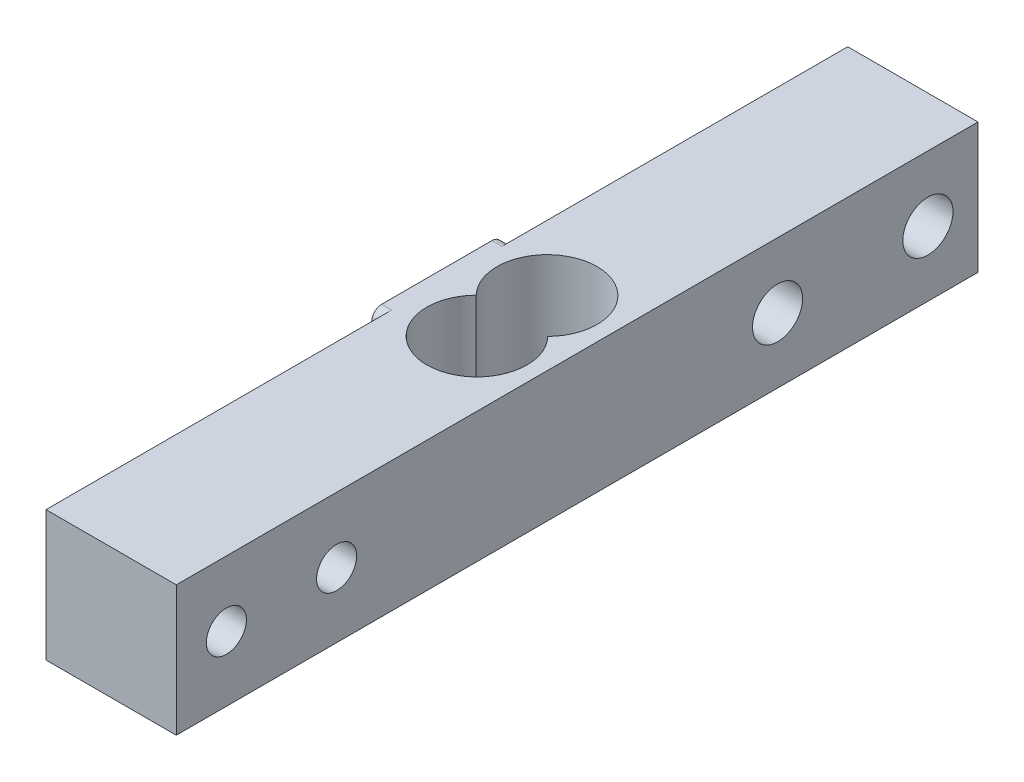
ISO-10303-21;
HEADER;
FILE_DESCRIPTION(('STEP AP214'),'2;1');
FILE_NAME('part.step','',(''),(''),'','','');
FILE_SCHEMA(('AUTOMOTIVE_DESIGN { 1 0 10303 214 1 1 1 1 }'));
ENDSEC;
DATA;
#1=APPLICATION_CONTEXT('core data for automotive mechanical design processes');
#2=APPLICATION_PROTOCOL_DEFINITION('international standard','automotive_design',2000,#1);
#3=PRODUCT_CONTEXT('',#1,'mechanical');
#4=PRODUCT('Part','Part','',(#3));
#5=PRODUCT_RELATED_PRODUCT_CATEGORY('part','',(#4));
#6=PRODUCT_DEFINITION_FORMATION('','',#4);
#7=PRODUCT_DEFINITION_CONTEXT('part definition',#1,'design');
#8=PRODUCT_DEFINITION('design','',#6,#7);
#9=PRODUCT_DEFINITION_SHAPE('','',#8);
#10=(LENGTH_UNIT() NAMED_UNIT(*) SI_UNIT(.MILLI.,.METRE.));
#11=(NAMED_UNIT(*) PLANE_ANGLE_UNIT() SI_UNIT($,.RADIAN.));
#12=(NAMED_UNIT(*) SI_UNIT($,.STERADIAN.) SOLID_ANGLE_UNIT());
#13=UNCERTAINTY_MEASURE_WITH_UNIT(LENGTH_MEASURE(1.E-05),#10,'distance_accuracy_value','');
#14=(GEOMETRIC_REPRESENTATION_CONTEXT(3) GLOBAL_UNCERTAINTY_ASSIGNED_CONTEXT((#13)) GLOBAL_UNIT_ASSIGNED_CONTEXT((#10,
#11,#12)) REPRESENTATION_CONTEXT('',''));
#15=CARTESIAN_POINT('',(0.,0.,0.));
#16=DIRECTION('',(0.,0.,1.));
#17=DIRECTION('',(1.,0.,0.));
#18=AXIS2_PLACEMENT_3D('',#15,#16,#17);
#19=CARTESIAN_POINT('',(-6.5,6.5,40.));
#20=DIRECTION('',(1.,0.,0.));
#21=DIRECTION('',(0.,1.,0.));
#22=AXIS2_PLACEMENT_3D('',#19,#20,#21);
#23=PLANE('',#22);
#24=CARTESIAN_POINT('',(-6.5,0.,24.));
#25=DIRECTION('',(1.,0.,0.));
#26=DIRECTION('',(0.,0.,-1.));
#27=AXIS2_PLACEMENT_3D('',#24,#25,#26);
#28=CIRCLE('',#27,2.);
#29=CARTESIAN_POINT('',(-6.5,0.,22.));
#30=VERTEX_POINT('',#29);
#31=EDGE_CURVE('E309',#30,#30,#28,.T.);
#32=ORIENTED_EDGE('',*,*,#31,.T.);
#33=EDGE_LOOP('',(#32));
#34=FACE_BOUND('',#33,.T.);
#35=CARTESIAN_POINT('',(-6.5,0.,35.));
#36=DIRECTION('',(1.,0.,0.));
#37=DIRECTION('',(0.,0.,-1.));
#38=AXIS2_PLACEMENT_3D('',#35,#36,#37);
#39=CIRCLE('',#38,2.);
#40=CARTESIAN_POINT('',(-6.5,0.,33.));
#41=VERTEX_POINT('',#40);
#42=EDGE_CURVE('E173',#41,#41,#39,.T.);
#43=ORIENTED_EDGE('',*,*,#42,.T.);
#44=EDGE_LOOP('',(#43));
#45=FACE_BOUND('',#44,.T.);
#46=DIRECTION('',(0.,1.,0.));
#47=VECTOR('',#46,1.);
#48=CARTESIAN_POINT('',(-6.5,6.5,6.5));
#49=LINE('',#48,#47);
#50=CARTESIAN_POINT('',(-6.5,-5.5,6.5));
#51=VERTEX_POINT('',#50);
#52=CARTESIAN_POINT('',(-6.5,5.5,6.5));
#53=VERTEX_POINT('',#52);
#54=EDGE_CURVE('E296',#51,#53,#49,.T.);
#55=ORIENTED_EDGE('',*,*,#54,.F.);
#56=CARTESIAN_POINT('',(-6.5,-5.5,5.5));
#57=DIRECTION('',(1.,0.,0.));
#58=DIRECTION('',(0.,1.,0.));
#59=AXIS2_PLACEMENT_3D('',#56,#57,#58);
#60=CIRCLE('',#59,1.);
#61=CARTESIAN_POINT('',(-6.5,-6.5,5.5));
#62=VERTEX_POINT('',#61);
#63=EDGE_CURVE('E260',#51,#62,#60,.T.);
#64=ORIENTED_EDGE('',*,*,#63,.T.);
#65=DIRECTION('',(0.,0.,-1.));
#66=VECTOR('',#65,1.);
#67=CARTESIAN_POINT('',(-6.5,-6.5,40.));
#68=LINE('',#67,#66);
#69=CARTESIAN_POINT('',(-6.5,-6.5,40.));
#70=VERTEX_POINT('',#69);
#71=EDGE_CURVE('E210',#70,#62,#68,.T.);
#72=ORIENTED_EDGE('',*,*,#71,.F.);
#73=DIRECTION('',(0.,-1.,0.));
#74=VECTOR('',#73,1.);
#75=CARTESIAN_POINT('',(-6.5,6.5,40.));
#76=LINE('',#75,#74);
#77=CARTESIAN_POINT('',(-6.5,6.5,40.));
#78=VERTEX_POINT('',#77);
#79=EDGE_CURVE('E186',#78,#70,#76,.T.);
#80=ORIENTED_EDGE('',*,*,#79,.F.);
#81=DIRECTION('',(0.,0.,-1.));
#82=VECTOR('',#81,1.);
#83=CARTESIAN_POINT('',(-6.5,6.5,40.));
#84=LINE('',#83,#82);
#85=CARTESIAN_POINT('',(-6.5,6.5,5.5));
#86=VERTEX_POINT('',#85);
#87=EDGE_CURVE('E214',#78,#86,#84,.T.);
#88=ORIENTED_EDGE('',*,*,#87,.T.);
#89=CARTESIAN_POINT('',(-6.5,5.5,5.5));
#90=DIRECTION('',(1.,0.,0.));
#91=DIRECTION('',(0.,1.,0.));
#92=AXIS2_PLACEMENT_3D('',#89,#90,#91);
#93=CIRCLE('',#92,1.);
#94=EDGE_CURVE('E264',#86,#53,#93,.T.);
#95=ORIENTED_EDGE('',*,*,#94,.T.);
#96=EDGE_LOOP('',(#55,#64,#72,#80,#88,#95));
#97=FACE_BOUND('',#96,.T.);
#98=ADVANCED_FACE('F40',(#34,#45,#97),#23,.F.);
#99=CARTESIAN_POINT('',(-6.5,0.,-35.));
#100=DIRECTION('',(1.,0.,0.));
#101=DIRECTION('',(0.,0.,-1.));
#102=AXIS2_PLACEMENT_3D('',#99,#100,#101);
#103=CIRCLE('',#102,2.5);
#104=CARTESIAN_POINT('',(-6.5,0.,-37.5));
#105=VERTEX_POINT('',#104);
#106=EDGE_CURVE('E324',#105,#105,#103,.T.);
#107=ORIENTED_EDGE('',*,*,#106,.T.);
#108=EDGE_LOOP('',(#107));
#109=FACE_BOUND('',#108,.T.);
#110=CARTESIAN_POINT('',(-6.5,0.,-20.));
#111=DIRECTION('',(1.,0.,0.));
#112=DIRECTION('',(0.,0.,-1.));
#113=AXIS2_PLACEMENT_3D('',#110,#111,#112);
#114=CIRCLE('',#113,2.5);
#115=CARTESIAN_POINT('',(-6.5,0.,-22.5));
#116=VERTEX_POINT('',#115);
#117=EDGE_CURVE('E317',#116,#116,#114,.T.);
#118=ORIENTED_EDGE('',*,*,#117,.T.);
#119=EDGE_LOOP('',(#118));
#120=FACE_BOUND('',#119,.T.);
#121=DIRECTION('',(0.,-1.,0.));
#122=VECTOR('',#121,1.);
#123=CARTESIAN_POINT('',(-6.5,6.5,-6.5));
#124=LINE('',#123,#122);
#125=CARTESIAN_POINT('',(-6.5,5.5,-6.5));
#126=VERTEX_POINT('',#125);
#127=CARTESIAN_POINT('',(-6.5,-5.5,-6.5));
#128=VERTEX_POINT('',#127);
#129=EDGE_CURVE('E268',#126,#128,#124,.T.);
#130=ORIENTED_EDGE('',*,*,#129,.F.);
#131=CARTESIAN_POINT('',(-6.5,5.5,-5.5));
#132=DIRECTION('',(1.,0.,0.));
#133=DIRECTION('',(0.,1.,0.));
#134=AXIS2_PLACEMENT_3D('',#131,#132,#133);
#135=CIRCLE('',#134,1.);
#136=CARTESIAN_POINT('',(-6.5,6.5,-5.5));
#137=VERTEX_POINT('',#136);
#138=EDGE_CURVE('E49',#126,#137,#135,.T.);
#139=ORIENTED_EDGE('',*,*,#138,.T.);
#140=CARTESIAN_POINT('',(-6.5,6.5,-40.));
#141=VERTEX_POINT('',#140);
#142=EDGE_CURVE('E213',#137,#141,#84,.T.);
#143=ORIENTED_EDGE('',*,*,#142,.T.);
#144=DIRECTION('',(0.,-1.,0.));
#145=VECTOR('',#144,1.);
#146=CARTESIAN_POINT('',(-6.5,6.5,-40.));
#147=LINE('',#146,#145);
#148=CARTESIAN_POINT('',(-6.5,-6.5,-40.));
#149=VERTEX_POINT('',#148);
#150=EDGE_CURVE('E200',#141,#149,#147,.T.);
#151=ORIENTED_EDGE('',*,*,#150,.T.);
#152=CARTESIAN_POINT('',(-6.5,-6.5,-5.5));
#153=VERTEX_POINT('',#152);
#154=EDGE_CURVE('E209',#153,#149,#68,.T.);
#155=ORIENTED_EDGE('',*,*,#154,.F.);
#156=CARTESIAN_POINT('',(-6.5,-5.5,-5.5));
#157=DIRECTION('',(1.,0.,0.));
#158=DIRECTION('',(0.,1.,0.));
#159=AXIS2_PLACEMENT_3D('',#156,#157,#158);
#160=CIRCLE('',#159,1.);
#161=EDGE_CURVE('E11',#153,#128,#160,.T.);
#162=ORIENTED_EDGE('',*,*,#161,.T.);
#163=EDGE_LOOP('',(#130,#139,#143,#151,#155,#162));
#164=FACE_BOUND('',#163,.T.);
#165=ADVANCED_FACE('F267',(#109,#120,#164),#23,.F.);
#166=CARTESIAN_POINT('',(6.5,6.5,40.));
#167=DIRECTION('',(-1.,0.,0.));
#168=DIRECTION('',(0.,0.,1.));
#169=AXIS2_PLACEMENT_3D('',#166,#167,#168);
#170=PLANE('',#169);
#171=CARTESIAN_POINT('',(6.5,0.,35.));
#172=DIRECTION('',(1.,0.,0.));
#173=DIRECTION('',(0.,0.,-1.));
#174=AXIS2_PLACEMENT_3D('',#171,#172,#173);
#175=CIRCLE('',#174,2.);
#176=CARTESIAN_POINT('',(6.5,0.,33.));
#177=VERTEX_POINT('',#176);
#178=EDGE_CURVE('E305',#177,#177,#175,.T.);
#179=ORIENTED_EDGE('',*,*,#178,.F.);
#180=EDGE_LOOP('',(#179));
#181=FACE_BOUND('',#180,.T.);
#182=CARTESIAN_POINT('',(6.5,0.,24.));
#183=DIRECTION('',(1.,0.,0.));
#184=DIRECTION('',(0.,0.,-1.));
#185=AXIS2_PLACEMENT_3D('',#182,#183,#184);
#186=CIRCLE('',#185,2.);
#187=CARTESIAN_POINT('',(6.5,0.,22.));
#188=VERTEX_POINT('',#187);
#189=EDGE_CURVE('E313',#188,#188,#186,.T.);
#190=ORIENTED_EDGE('',*,*,#189,.F.);
#191=EDGE_LOOP('',(#190));
#192=FACE_BOUND('',#191,.T.);
#193=CARTESIAN_POINT('',(6.5,0.,-20.));
#194=DIRECTION('',(1.,0.,0.));
#195=DIRECTION('',(0.,0.,-1.));
#196=AXIS2_PLACEMENT_3D('',#193,#194,#195);
#197=CIRCLE('',#196,2.5);
#198=CARTESIAN_POINT('',(6.5,0.,-22.5));
#199=VERTEX_POINT('',#198);
#200=EDGE_CURVE('E321',#199,#199,#197,.T.);
#201=ORIENTED_EDGE('',*,*,#200,.F.);
#202=EDGE_LOOP('',(#201));
#203=FACE_BOUND('',#202,.T.);
#204=CARTESIAN_POINT('',(6.5,0.,-35.));
#205=DIRECTION('',(1.,0.,0.));
#206=DIRECTION('',(0.,0.,-1.));
#207=AXIS2_PLACEMENT_3D('',#204,#205,#206);
#208=CIRCLE('',#207,2.5);
#209=CARTESIAN_POINT('',(6.5,0.,-37.5));
#210=VERTEX_POINT('',#209);
#211=EDGE_CURVE('E169',#210,#210,#208,.T.);
#212=ORIENTED_EDGE('',*,*,#211,.F.);
#213=EDGE_LOOP('',(#212));
#214=FACE_BOUND('',#213,.T.);
#215=DIRECTION('',(0.,1.,0.));
#216=VECTOR('',#215,1.);
#217=CARTESIAN_POINT('',(6.5,6.5,-40.));
#218=LINE('',#217,#216);
#219=CARTESIAN_POINT('',(6.5,-6.5,-40.));
#220=VERTEX_POINT('',#219);
#221=CARTESIAN_POINT('',(6.5,6.5,-40.));
#222=VERTEX_POINT('',#221);
#223=EDGE_CURVE('E176',#220,#222,#218,.T.);
#224=ORIENTED_EDGE('',*,*,#223,.T.);
#225=DIRECTION('',(0.,0.,-1.));
#226=VECTOR('',#225,1.);
#227=CARTESIAN_POINT('',(6.5,6.5,40.));
#228=LINE('',#227,#226);
#229=CARTESIAN_POINT('',(6.5,6.5,40.));
#230=VERTEX_POINT('',#229);
#231=EDGE_CURVE('E217',#230,#222,#228,.T.);
#232=ORIENTED_EDGE('',*,*,#231,.F.);
#233=DIRECTION('',(0.,1.,0.));
#234=VECTOR('',#233,1.);
#235=CARTESIAN_POINT('',(6.5,6.5,40.));
#236=LINE('',#235,#234);
#237=CARTESIAN_POINT('',(6.5,-6.5,40.));
#238=VERTEX_POINT('',#237);
#239=EDGE_CURVE('E178',#238,#230,#236,.T.);
#240=ORIENTED_EDGE('',*,*,#239,.F.);
#241=DIRECTION('',(0.,0.,-1.));
#242=VECTOR('',#241,1.);
#243=CARTESIAN_POINT('',(6.5,-6.5,40.));
#244=LINE('',#243,#242);
#245=EDGE_CURVE('E192',#238,#220,#244,.T.);
#246=ORIENTED_EDGE('',*,*,#245,.T.);
#247=EDGE_LOOP('',(#224,#232,#240,#246));
#248=FACE_BOUND('',#247,.T.);
#249=ADVANCED_FACE('F335',(#181,#192,#203,#214,#248),#170,.F.);
#250=CARTESIAN_POINT('',(-6.5,6.5,40.));
#251=DIRECTION('',(0.,-1.,0.));
#252=DIRECTION('',(1.,0.,0.));
#253=AXIS2_PLACEMENT_3D('',#250,#251,#252);
#254=PLANE('',#253);
#255=CARTESIAN_POINT('',(0.,6.5,-3.5));
#256=DIRECTION('',(0.,1.,0.));
#257=DIRECTION('',(-1.,0.,0.));
#258=AXIS2_PLACEMENT_3D('',#255,#256,#257);
#259=CIRCLE('',#258,5.);
#260=CARTESIAN_POINT('',(3.57071421427142,6.5,0.));
#261=VERTEX_POINT('',#260);
#262=CARTESIAN_POINT('',(-3.57071421427143,6.5,0.));
#263=VERTEX_POINT('',#262);
#264=EDGE_CURVE('E164',#261,#263,#259,.T.);
#265=ORIENTED_EDGE('',*,*,#264,.F.);
#266=CARTESIAN_POINT('',(0.,6.5,3.5));
#267=DIRECTION('',(0.,1.,0.));
#268=DIRECTION('',(-1.,0.,0.));
#269=AXIS2_PLACEMENT_3D('',#266,#267,#268);
#270=CIRCLE('',#269,5.);
#271=EDGE_CURVE('E148',#263,#261,#270,.T.);
#272=ORIENTED_EDGE('',*,*,#271,.F.);
#273=EDGE_LOOP('',(#265,#272));
#274=FACE_BOUND('',#273,.T.);
#275=DIRECTION('',(0.,0.,-1.));
#276=VECTOR('',#275,1.);
#277=CARTESIAN_POINT('',(-7.5,6.5,-6.5));
#278=LINE('',#277,#276);
#279=CARTESIAN_POINT('',(-7.5,6.5,5.49999999999999));
#280=VERTEX_POINT('',#279);
#281=CARTESIAN_POINT('',(-7.5,6.5,-5.5));
#282=VERTEX_POINT('',#281);
#283=EDGE_CURVE('E275',#280,#282,#278,.T.);
#284=ORIENTED_EDGE('',*,*,#283,.F.);
#285=DIRECTION('',(1.,0.,0.));
#286=VECTOR('',#285,1.);
#287=CARTESIAN_POINT('',(-6.5,6.5,5.5));
#288=LINE('',#287,#286);
#289=EDGE_CURVE('E250',#280,#86,#288,.T.);
#290=ORIENTED_EDGE('',*,*,#289,.T.);
#291=ORIENTED_EDGE('',*,*,#87,.F.);
#292=DIRECTION('',(-1.,0.,0.));
#293=VECTOR('',#292,1.);
#294=CARTESIAN_POINT('',(-6.5,6.5,40.));
#295=LINE('',#294,#293);
#296=EDGE_CURVE('E182',#230,#78,#295,.T.);
#297=ORIENTED_EDGE('',*,*,#296,.F.);
#298=ORIENTED_EDGE('',*,*,#231,.T.);
#299=DIRECTION('',(-1.,0.,0.));
#300=VECTOR('',#299,1.);
#301=CARTESIAN_POINT('',(-6.5,6.5,-40.));
#302=LINE('',#301,#300);
#303=EDGE_CURVE('E196',#222,#141,#302,.T.);
#304=ORIENTED_EDGE('',*,*,#303,.T.);
#305=ORIENTED_EDGE('',*,*,#142,.F.);
#306=DIRECTION('',(1.,0.,0.));
#307=VECTOR('',#306,1.);
#308=CARTESIAN_POINT('',(-6.5,6.5,-5.5));
#309=LINE('',#308,#307);
#310=EDGE_CURVE('E247',#137,#282,#309,.F.);
#311=ORIENTED_EDGE('',*,*,#310,.T.);
#312=EDGE_LOOP('',(#284,#290,#291,#297,#298,#304,#305,#311));
#313=FACE_BOUND('',#312,.T.);
#314=ADVANCED_FACE('F274',(#274,#313),#254,.F.);
#315=CARTESIAN_POINT('',(-6.5,-6.5,40.));
#316=DIRECTION('',(0.,1.,0.));
#317=DIRECTION('',(-1.,0.,0.));
#318=AXIS2_PLACEMENT_3D('',#315,#316,#317);
#319=PLANE('',#318);
#320=CARTESIAN_POINT('',(0.,-6.5,-3.5));
#321=DIRECTION('',(0.,1.,0.));
#322=DIRECTION('',(-1.,0.,0.));
#323=AXIS2_PLACEMENT_3D('',#320,#321,#322);
#324=CIRCLE('',#323,5.);
#325=CARTESIAN_POINT('',(3.57071421427143,-6.5,0.));
#326=VERTEX_POINT('',#325);
#327=CARTESIAN_POINT('',(-3.57071421427142,-6.5,0.));
#328=VERTEX_POINT('',#327);
#329=EDGE_CURVE('E154',#326,#328,#324,.T.);
#330=ORIENTED_EDGE('',*,*,#329,.T.);
#331=CARTESIAN_POINT('',(0.,-6.5,3.5));
#332=DIRECTION('',(0.,1.,0.));
#333=DIRECTION('',(-1.,0.,0.));
#334=AXIS2_PLACEMENT_3D('',#331,#332,#333);
#335=CIRCLE('',#334,5.);
#336=EDGE_CURVE('E145',#328,#326,#335,.T.);
#337=ORIENTED_EDGE('',*,*,#336,.T.);
#338=EDGE_LOOP('',(#330,#337));
#339=FACE_BOUND('',#338,.T.);
#340=ORIENTED_EDGE('',*,*,#71,.T.);
#341=DIRECTION('',(1.,0.,0.));
#342=VECTOR('',#341,1.);
#343=CARTESIAN_POINT('',(-6.5,-6.5,5.5));
#344=LINE('',#343,#342);
#345=CARTESIAN_POINT('',(-7.5,-6.5,5.5));
#346=VERTEX_POINT('',#345);
#347=EDGE_CURVE('E232',#62,#346,#344,.F.);
#348=ORIENTED_EDGE('',*,*,#347,.T.);
#349=DIRECTION('',(0.,0.,1.));
#350=VECTOR('',#349,1.);
#351=CARTESIAN_POINT('',(-7.5,-6.5,-6.5));
#352=LINE('',#351,#350);
#353=CARTESIAN_POINT('',(-7.5,-6.5,-5.5));
#354=VERTEX_POINT('',#353);
#355=EDGE_CURVE('E290',#354,#346,#352,.T.);
#356=ORIENTED_EDGE('',*,*,#355,.F.);
#357=DIRECTION('',(1.,0.,0.));
#358=VECTOR('',#357,1.);
#359=CARTESIAN_POINT('',(-6.5,-6.5,-5.5));
#360=LINE('',#359,#358);
#361=EDGE_CURVE('E228',#354,#153,#360,.T.);
#362=ORIENTED_EDGE('',*,*,#361,.T.);
#363=ORIENTED_EDGE('',*,*,#154,.T.);
#364=DIRECTION('',(1.,0.,0.));
#365=VECTOR('',#364,1.);
#366=CARTESIAN_POINT('',(-6.5,-6.5,-40.));
#367=LINE('',#366,#365);
#368=EDGE_CURVE('E183',#149,#220,#367,.T.);
#369=ORIENTED_EDGE('',*,*,#368,.T.);
#370=ORIENTED_EDGE('',*,*,#245,.F.);
#371=DIRECTION('',(1.,0.,0.));
#372=VECTOR('',#371,1.);
#373=CARTESIAN_POINT('',(-6.5,-6.5,40.));
#374=LINE('',#373,#372);
#375=EDGE_CURVE('E189',#70,#238,#374,.T.);
#376=ORIENTED_EDGE('',*,*,#375,.F.);
#377=EDGE_LOOP('',(#340,#348,#356,#362,#363,#369,#370,#376));
#378=FACE_BOUND('',#377,.T.);
#379=ADVANCED_FACE('F161',(#339,#378),#319,.F.);
#380=CARTESIAN_POINT('',(0.,0.,40.));
#381=DIRECTION('',(0.,0.,1.));
#382=DIRECTION('',(1.,0.,0.));
#383=AXIS2_PLACEMENT_3D('',#380,#381,#382);
#384=PLANE('',#383);
#385=ORIENTED_EDGE('',*,*,#239,.T.);
#386=ORIENTED_EDGE('',*,*,#296,.T.);
#387=ORIENTED_EDGE('',*,*,#79,.T.);
#388=ORIENTED_EDGE('',*,*,#375,.T.);
#389=EDGE_LOOP('',(#385,#386,#387,#388));
#390=FACE_BOUND('',#389,.T.);
#391=ADVANCED_FACE('F351',(#390),#384,.T.);
#392=CARTESIAN_POINT('',(0.,0.,-40.));
#393=DIRECTION('',(0.,0.,1.));
#394=DIRECTION('',(1.,0.,0.));
#395=AXIS2_PLACEMENT_3D('',#392,#393,#394);
#396=PLANE('',#395);
#397=ORIENTED_EDGE('',*,*,#223,.F.);
#398=ORIENTED_EDGE('',*,*,#368,.F.);
#399=ORIENTED_EDGE('',*,*,#150,.F.);
#400=ORIENTED_EDGE('',*,*,#303,.F.);
#401=EDGE_LOOP('',(#397,#398,#399,#400));
#402=FACE_BOUND('',#401,.T.);
#403=ADVANCED_FACE('F346',(#402),#396,.F.);
#404=CARTESIAN_POINT('',(0.,-6.5,3.5));
#405=DIRECTION('',(0.,1.,0.));
#406=DIRECTION('',(-1.,0.,0.));
#407=AXIS2_PLACEMENT_3D('',#404,#405,#406);
#408=CYLINDRICAL_SURFACE('',#407,5.);
#409=ORIENTED_EDGE('',*,*,#271,.T.);
#410=DIRECTION('',(0.,1.,0.));
#411=VECTOR('',#410,1.);
#412=CARTESIAN_POINT('',(3.57071421427143,-6.5,0.));
#413=LINE('',#412,#411);
#414=EDGE_CURVE('E141',#326,#261,#413,.T.);
#415=ORIENTED_EDGE('',*,*,#414,.F.);
#416=ORIENTED_EDGE('',*,*,#336,.F.);
#417=DIRECTION('',(0.,1.,0.));
#418=VECTOR('',#417,1.);
#419=CARTESIAN_POINT('',(-3.57071421427142,-6.5,0.));
#420=LINE('',#419,#418);
#421=EDGE_CURVE('E153',#328,#263,#420,.T.);
#422=ORIENTED_EDGE('',*,*,#421,.T.);
#423=EDGE_LOOP('',(#409,#415,#416,#422));
#424=FACE_BOUND('',#423,.T.);
#425=ADVANCED_FACE('F143',(#424),#408,.F.);
#426=CARTESIAN_POINT('',(0.,-6.5,-3.5));
#427=DIRECTION('',(0.,1.,0.));
#428=DIRECTION('',(-1.,0.,0.));
#429=AXIS2_PLACEMENT_3D('',#426,#427,#428);
#430=CYLINDRICAL_SURFACE('',#429,5.);
#431=ORIENTED_EDGE('',*,*,#264,.T.);
#432=ORIENTED_EDGE('',*,*,#421,.F.);
#433=ORIENTED_EDGE('',*,*,#329,.F.);
#434=ORIENTED_EDGE('',*,*,#414,.T.);
#435=EDGE_LOOP('',(#431,#432,#433,#434));
#436=FACE_BOUND('',#435,.T.);
#437=ADVANCED_FACE('F157',(#436),#430,.F.);
#438=CARTESIAN_POINT('',(-6.5,0.,-35.));
#439=DIRECTION('',(1.,0.,0.));
#440=DIRECTION('',(0.,0.,-1.));
#441=AXIS2_PLACEMENT_3D('',#438,#439,#440);
#442=CYLINDRICAL_SURFACE('',#441,2.5);
#443=CARTESIAN_POINT('',(-6.5,0.,-37.5));
#444=CARTESIAN_POINT('',(-6.36458333333333,0.,-37.5));
#445=CARTESIAN_POINT('',(-6.22916666666667,0.,-37.5));
#446=CARTESIAN_POINT('',(-5.95833333333333,0.,-37.5));
#447=CARTESIAN_POINT('',(-5.82291666666667,0.,-37.5));
#448=CARTESIAN_POINT('',(-5.55208333333333,0.,-37.5));
#449=CARTESIAN_POINT('',(-5.41666666666667,0.,-37.5));
#450=CARTESIAN_POINT('',(-5.14583333333333,0.,-37.5));
#451=CARTESIAN_POINT('',(-5.01041666666667,0.,-37.5));
#452=CARTESIAN_POINT('',(-4.73958333333333,0.,-37.5));
#453=CARTESIAN_POINT('',(-4.60416666666667,0.,-37.5));
#454=CARTESIAN_POINT('',(-4.33333333333333,0.,-37.5));
#455=CARTESIAN_POINT('',(-4.19791666666667,0.,-37.5));
#456=CARTESIAN_POINT('',(-3.92708333333333,0.,-37.5));
#457=CARTESIAN_POINT('',(-3.79166666666667,0.,-37.5));
#458=CARTESIAN_POINT('',(-3.52083333333333,0.,-37.5));
#459=CARTESIAN_POINT('',(-3.38541666666667,0.,-37.5));
#460=CARTESIAN_POINT('',(-3.11458333333333,0.,-37.5));
#461=CARTESIAN_POINT('',(-2.97916666666667,0.,-37.5));
#462=CARTESIAN_POINT('',(-2.70833333333333,0.,-37.5));
#463=CARTESIAN_POINT('',(-2.57291666666667,0.,-37.5));
#464=CARTESIAN_POINT('',(-2.30208333333333,0.,-37.5));
#465=CARTESIAN_POINT('',(-2.16666666666667,0.,-37.5));
#466=CARTESIAN_POINT('',(-1.89583333333333,0.,-37.5));
#467=CARTESIAN_POINT('',(-1.76041666666667,0.,-37.5));
#468=CARTESIAN_POINT('',(-1.48958333333333,0.,-37.5));
#469=CARTESIAN_POINT('',(-1.35416666666667,0.,-37.5));
#470=CARTESIAN_POINT('',(-1.08333333333333,0.,-37.5));
#471=CARTESIAN_POINT('',(-0.947916666666668,0.,-37.5));
#472=CARTESIAN_POINT('',(-0.677083333333334,0.,-37.5));
#473=CARTESIAN_POINT('',(-0.541666666666668,0.,-37.5));
#474=CARTESIAN_POINT('',(-0.270833333333334,0.,-37.5));
#475=CARTESIAN_POINT('',(-0.135416666666668,0.,-37.5));
#476=CARTESIAN_POINT('',(0.135416666666666,0.,-37.5));
#477=CARTESIAN_POINT('',(0.270833333333333,0.,-37.5));
#478=CARTESIAN_POINT('',(0.541666666666666,0.,-37.5));
#479=CARTESIAN_POINT('',(0.677083333333332,0.,-37.5));
#480=CARTESIAN_POINT('',(0.947916666666666,0.,-37.5));
#481=CARTESIAN_POINT('',(1.08333333333333,0.,-37.5));
#482=CARTESIAN_POINT('',(1.35416666666667,0.,-37.5));
#483=CARTESIAN_POINT('',(1.48958333333333,0.,-37.5));
#484=CARTESIAN_POINT('',(1.76041666666667,0.,-37.5));
#485=CARTESIAN_POINT('',(1.89583333333333,0.,-37.5));
#486=CARTESIAN_POINT('',(2.16666666666667,0.,-37.5));
#487=CARTESIAN_POINT('',(2.30208333333333,0.,-37.5));
#488=CARTESIAN_POINT('',(2.57291666666667,0.,-37.5));
#489=CARTESIAN_POINT('',(2.70833333333333,0.,-37.5));
#490=CARTESIAN_POINT('',(2.97916666666667,0.,-37.5));
#491=CARTESIAN_POINT('',(3.11458333333333,0.,-37.5));
#492=CARTESIAN_POINT('',(3.38541666666667,0.,-37.5));
#493=CARTESIAN_POINT('',(3.52083333333333,0.,-37.5));
#494=CARTESIAN_POINT('',(3.79166666666667,0.,-37.5));
#495=CARTESIAN_POINT('',(3.92708333333333,0.,-37.5));
#496=CARTESIAN_POINT('',(4.19791666666667,0.,-37.5));
#497=CARTESIAN_POINT('',(4.33333333333333,0.,-37.5));
#498=CARTESIAN_POINT('',(4.60416666666667,0.,-37.5));
#499=CARTESIAN_POINT('',(4.73958333333333,0.,-37.5));
#500=CARTESIAN_POINT('',(5.01041666666667,0.,-37.5));
#501=CARTESIAN_POINT('',(5.14583333333333,0.,-37.5));
#502=CARTESIAN_POINT('',(5.41666666666667,0.,-37.5));
#503=CARTESIAN_POINT('',(5.55208333333333,0.,-37.5));
#504=CARTESIAN_POINT('',(5.82291666666667,0.,-37.5));
#505=CARTESIAN_POINT('',(5.95833333333333,0.,-37.5));
#506=CARTESIAN_POINT('',(6.22916666666667,0.,-37.5));
#507=CARTESIAN_POINT('',(6.36458333333333,0.,-37.5));
#508=CARTESIAN_POINT('',(6.5,0.,-37.5));
#509=B_SPLINE_CURVE_WITH_KNOTS('',3,(#443,#444,#445,#446,#447,#448,#449,#450,#451,#452,#453,
#454,#455,#456,#457,#458,#459,#460,#461,#462,#463,#464,#465,#466,#467,#468,#469,#470,#471,#472,
#473,#474,#475,#476,#477,#478,#479,#480,#481,#482,#483,#484,#485,#486,#487,#488,#489,#490,#491,
#492,#493,#494,#495,#496,#497,#498,#499,#500,#501,#502,#503,#504,#505,#506,#507,#508),
.UNSPECIFIED.,.F.,.F.,(4,2,2,2,2,2,2,2,2,2,2,2,2,2,2,2,2,2,2,2,2,2,2,2,2,2,2,2,2,2,2,2,4),(0.,
0.40625,0.812500000000001,1.21875,1.625,2.03125,2.4375,2.84375,3.25,3.65625,4.0625,4.46875,
4.875,5.28125,5.6875,6.09375,6.5,6.90625,7.3125,7.71875,8.125,8.53125,8.9375,9.34375,9.75,
10.15625,10.5625,10.96875,11.375,11.78125,12.1875,12.59375,13.),.UNSPECIFIED.);
#510=EDGE_CURVE('BSEAM333',#105,#210,#509,.T.);
#511=ORIENTED_EDGE('',*,*,#106,.F.);
#512=ORIENTED_EDGE('',*,*,#211,.T.);
#513=ORIENTED_EDGE('',*,*,#510,.T.);
#514=ORIENTED_EDGE('',*,*,#510,.F.);
#515=EDGE_LOOP('',(#511,#513,#512,#514));
#516=FACE_BOUND('',#515,.T.);
#517=ADVANCED_FACE('F333',(#516),#442,.F.);
#518=CARTESIAN_POINT('',(-6.5,0.,-20.));
#519=DIRECTION('',(1.,0.,0.));
#520=DIRECTION('',(0.,0.,-1.));
#521=AXIS2_PLACEMENT_3D('',#518,#519,#520);
#522=CYLINDRICAL_SURFACE('',#521,2.5);
#523=CARTESIAN_POINT('',(-6.5,0.,-22.5));
#524=CARTESIAN_POINT('',(-6.36458333333333,0.,-22.5));
#525=CARTESIAN_POINT('',(-6.22916666666667,0.,-22.5));
#526=CARTESIAN_POINT('',(-5.95833333333333,0.,-22.5));
#527=CARTESIAN_POINT('',(-5.82291666666667,0.,-22.5));
#528=CARTESIAN_POINT('',(-5.55208333333333,0.,-22.5));
#529=CARTESIAN_POINT('',(-5.41666666666667,0.,-22.5));
#530=CARTESIAN_POINT('',(-5.14583333333333,0.,-22.5));
#531=CARTESIAN_POINT('',(-5.01041666666667,0.,-22.5));
#532=CARTESIAN_POINT('',(-4.73958333333333,0.,-22.5));
#533=CARTESIAN_POINT('',(-4.60416666666667,0.,-22.5));
#534=CARTESIAN_POINT('',(-4.33333333333333,0.,-22.5));
#535=CARTESIAN_POINT('',(-4.19791666666667,0.,-22.5));
#536=CARTESIAN_POINT('',(-3.92708333333333,0.,-22.5));
#537=CARTESIAN_POINT('',(-3.79166666666667,0.,-22.5));
#538=CARTESIAN_POINT('',(-3.52083333333333,0.,-22.5));
#539=CARTESIAN_POINT('',(-3.38541666666667,0.,-22.5));
#540=CARTESIAN_POINT('',(-3.11458333333333,0.,-22.5));
#541=CARTESIAN_POINT('',(-2.97916666666667,0.,-22.5));
#542=CARTESIAN_POINT('',(-2.70833333333333,0.,-22.5));
#543=CARTESIAN_POINT('',(-2.57291666666667,0.,-22.5));
#544=CARTESIAN_POINT('',(-2.30208333333333,0.,-22.5));
#545=CARTESIAN_POINT('',(-2.16666666666667,0.,-22.5));
#546=CARTESIAN_POINT('',(-1.89583333333333,0.,-22.5));
#547=CARTESIAN_POINT('',(-1.76041666666667,0.,-22.5));
#548=CARTESIAN_POINT('',(-1.48958333333333,0.,-22.5));
#549=CARTESIAN_POINT('',(-1.35416666666667,0.,-22.5));
#550=CARTESIAN_POINT('',(-1.08333333333333,0.,-22.5));
#551=CARTESIAN_POINT('',(-0.947916666666668,0.,-22.5));
#552=CARTESIAN_POINT('',(-0.677083333333334,0.,-22.5));
#553=CARTESIAN_POINT('',(-0.541666666666668,0.,-22.5));
#554=CARTESIAN_POINT('',(-0.270833333333334,0.,-22.5));
#555=CARTESIAN_POINT('',(-0.135416666666668,0.,-22.5));
#556=CARTESIAN_POINT('',(0.135416666666666,0.,-22.5));
#557=CARTESIAN_POINT('',(0.270833333333333,0.,-22.5));
#558=CARTESIAN_POINT('',(0.541666666666666,0.,-22.5));
#559=CARTESIAN_POINT('',(0.677083333333332,0.,-22.5));
#560=CARTESIAN_POINT('',(0.947916666666666,0.,-22.5));
#561=CARTESIAN_POINT('',(1.08333333333333,0.,-22.5));
#562=CARTESIAN_POINT('',(1.35416666666667,0.,-22.5));
#563=CARTESIAN_POINT('',(1.48958333333333,0.,-22.5));
#564=CARTESIAN_POINT('',(1.76041666666667,0.,-22.5));
#565=CARTESIAN_POINT('',(1.89583333333333,0.,-22.5));
#566=CARTESIAN_POINT('',(2.16666666666667,0.,-22.5));
#567=CARTESIAN_POINT('',(2.30208333333333,0.,-22.5));
#568=CARTESIAN_POINT('',(2.57291666666667,0.,-22.5));
#569=CARTESIAN_POINT('',(2.70833333333333,0.,-22.5));
#570=CARTESIAN_POINT('',(2.97916666666667,0.,-22.5));
#571=CARTESIAN_POINT('',(3.11458333333333,0.,-22.5));
#572=CARTESIAN_POINT('',(3.38541666666667,0.,-22.5));
#573=CARTESIAN_POINT('',(3.52083333333333,0.,-22.5));
#574=CARTESIAN_POINT('',(3.79166666666667,0.,-22.5));
#575=CARTESIAN_POINT('',(3.92708333333333,0.,-22.5));
#576=CARTESIAN_POINT('',(4.19791666666667,0.,-22.5));
#577=CARTESIAN_POINT('',(4.33333333333333,0.,-22.5));
#578=CARTESIAN_POINT('',(4.60416666666667,0.,-22.5));
#579=CARTESIAN_POINT('',(4.73958333333333,0.,-22.5));
#580=CARTESIAN_POINT('',(5.01041666666667,0.,-22.5));
#581=CARTESIAN_POINT('',(5.14583333333333,0.,-22.5));
#582=CARTESIAN_POINT('',(5.41666666666667,0.,-22.5));
#583=CARTESIAN_POINT('',(5.55208333333333,0.,-22.5));
#584=CARTESIAN_POINT('',(5.82291666666667,0.,-22.5));
#585=CARTESIAN_POINT('',(5.95833333333333,0.,-22.5));
#586=CARTESIAN_POINT('',(6.22916666666667,0.,-22.5));
#587=CARTESIAN_POINT('',(6.36458333333333,0.,-22.5));
#588=CARTESIAN_POINT('',(6.5,0.,-22.5));
#589=B_SPLINE_CURVE_WITH_KNOTS('',3,(#523,#524,#525,#526,#527,#528,#529,#530,#531,#532,#533,
#534,#535,#536,#537,#538,#539,#540,#541,#542,#543,#544,#545,#546,#547,#548,#549,#550,#551,#552,
#553,#554,#555,#556,#557,#558,#559,#560,#561,#562,#563,#564,#565,#566,#567,#568,#569,#570,#571,
#572,#573,#574,#575,#576,#577,#578,#579,#580,#581,#582,#583,#584,#585,#586,#587,#588),
.UNSPECIFIED.,.F.,.F.,(4,2,2,2,2,2,2,2,2,2,2,2,2,2,2,2,2,2,2,2,2,2,2,2,2,2,2,2,2,2,2,2,4),(0.,
0.40625,0.812500000000001,1.21875,1.625,2.03125,2.4375,2.84375,3.25,3.65625,4.0625,4.46875,
4.875,5.28125,5.6875,6.09375,6.5,6.90625,7.3125,7.71875,8.125,8.53125,8.9375,9.34375,9.75,
10.15625,10.5625,10.96875,11.375,11.78125,12.1875,12.59375,13.),.UNSPECIFIED.);
#590=EDGE_CURVE('BSEAM492',#116,#199,#589,.T.);
#591=ORIENTED_EDGE('',*,*,#117,.F.);
#592=ORIENTED_EDGE('',*,*,#200,.T.);
#593=ORIENTED_EDGE('',*,*,#590,.T.);
#594=ORIENTED_EDGE('',*,*,#590,.F.);
#595=EDGE_LOOP('',(#591,#593,#592,#594));
#596=FACE_BOUND('',#595,.T.);
#597=ADVANCED_FACE('F492',(#596),#522,.F.);
#598=CARTESIAN_POINT('',(-6.5,0.,24.));
#599=DIRECTION('',(1.,0.,0.));
#600=DIRECTION('',(0.,0.,-1.));
#601=AXIS2_PLACEMENT_3D('',#598,#599,#600);
#602=CYLINDRICAL_SURFACE('',#601,2.);
#603=CARTESIAN_POINT('',(-6.5,0.,22.));
#604=CARTESIAN_POINT('',(-6.36458333333333,0.,22.));
#605=CARTESIAN_POINT('',(-6.22916666666667,0.,22.));
#606=CARTESIAN_POINT('',(-5.95833333333333,0.,22.));
#607=CARTESIAN_POINT('',(-5.82291666666667,0.,22.));
#608=CARTESIAN_POINT('',(-5.55208333333333,0.,22.));
#609=CARTESIAN_POINT('',(-5.41666666666667,0.,22.));
#610=CARTESIAN_POINT('',(-5.14583333333333,0.,22.));
#611=CARTESIAN_POINT('',(-5.01041666666667,0.,22.));
#612=CARTESIAN_POINT('',(-4.73958333333333,0.,22.));
#613=CARTESIAN_POINT('',(-4.60416666666667,0.,22.));
#614=CARTESIAN_POINT('',(-4.33333333333333,0.,22.));
#615=CARTESIAN_POINT('',(-4.19791666666667,0.,22.));
#616=CARTESIAN_POINT('',(-3.92708333333333,0.,22.));
#617=CARTESIAN_POINT('',(-3.79166666666667,0.,22.));
#618=CARTESIAN_POINT('',(-3.52083333333333,0.,22.));
#619=CARTESIAN_POINT('',(-3.38541666666667,0.,22.));
#620=CARTESIAN_POINT('',(-3.11458333333333,0.,22.));
#621=CARTESIAN_POINT('',(-2.97916666666667,0.,22.));
#622=CARTESIAN_POINT('',(-2.70833333333333,0.,22.));
#623=CARTESIAN_POINT('',(-2.57291666666667,0.,22.));
#624=CARTESIAN_POINT('',(-2.30208333333333,0.,22.));
#625=CARTESIAN_POINT('',(-2.16666666666667,0.,22.));
#626=CARTESIAN_POINT('',(-1.89583333333333,0.,22.));
#627=CARTESIAN_POINT('',(-1.76041666666667,0.,22.));
#628=CARTESIAN_POINT('',(-1.48958333333333,0.,22.));
#629=CARTESIAN_POINT('',(-1.35416666666667,0.,22.));
#630=CARTESIAN_POINT('',(-1.08333333333333,0.,22.));
#631=CARTESIAN_POINT('',(-0.947916666666668,0.,22.));
#632=CARTESIAN_POINT('',(-0.677083333333334,0.,22.));
#633=CARTESIAN_POINT('',(-0.541666666666668,0.,22.));
#634=CARTESIAN_POINT('',(-0.270833333333334,0.,22.));
#635=CARTESIAN_POINT('',(-0.135416666666668,0.,22.));
#636=CARTESIAN_POINT('',(0.135416666666666,0.,22.));
#637=CARTESIAN_POINT('',(0.270833333333333,0.,22.));
#638=CARTESIAN_POINT('',(0.541666666666666,0.,22.));
#639=CARTESIAN_POINT('',(0.677083333333332,0.,22.));
#640=CARTESIAN_POINT('',(0.947916666666666,0.,22.));
#641=CARTESIAN_POINT('',(1.08333333333333,0.,22.));
#642=CARTESIAN_POINT('',(1.35416666666667,0.,22.));
#643=CARTESIAN_POINT('',(1.48958333333333,0.,22.));
#644=CARTESIAN_POINT('',(1.76041666666667,0.,22.));
#645=CARTESIAN_POINT('',(1.89583333333333,0.,22.));
#646=CARTESIAN_POINT('',(2.16666666666667,0.,22.));
#647=CARTESIAN_POINT('',(2.30208333333333,0.,22.));
#648=CARTESIAN_POINT('',(2.57291666666667,0.,22.));
#649=CARTESIAN_POINT('',(2.70833333333333,0.,22.));
#650=CARTESIAN_POINT('',(2.97916666666667,0.,22.));
#651=CARTESIAN_POINT('',(3.11458333333333,0.,22.));
#652=CARTESIAN_POINT('',(3.38541666666667,0.,22.));
#653=CARTESIAN_POINT('',(3.52083333333333,0.,22.));
#654=CARTESIAN_POINT('',(3.79166666666667,0.,22.));
#655=CARTESIAN_POINT('',(3.92708333333333,0.,22.));
#656=CARTESIAN_POINT('',(4.19791666666667,0.,22.));
#657=CARTESIAN_POINT('',(4.33333333333333,0.,22.));
#658=CARTESIAN_POINT('',(4.60416666666667,0.,22.));
#659=CARTESIAN_POINT('',(4.73958333333333,0.,22.));
#660=CARTESIAN_POINT('',(5.01041666666667,0.,22.));
#661=CARTESIAN_POINT('',(5.14583333333333,0.,22.));
#662=CARTESIAN_POINT('',(5.41666666666667,0.,22.));
#663=CARTESIAN_POINT('',(5.55208333333333,0.,22.));
#664=CARTESIAN_POINT('',(5.82291666666667,0.,22.));
#665=CARTESIAN_POINT('',(5.95833333333333,0.,22.));
#666=CARTESIAN_POINT('',(6.22916666666667,0.,22.));
#667=CARTESIAN_POINT('',(6.36458333333333,0.,22.));
#668=CARTESIAN_POINT('',(6.5,0.,22.));
#669=B_SPLINE_CURVE_WITH_KNOTS('',3,(#603,#604,#605,#606,#607,#608,#609,#610,#611,#612,#613,
#614,#615,#616,#617,#618,#619,#620,#621,#622,#623,#624,#625,#626,#627,#628,#629,#630,#631,#632,
#633,#634,#635,#636,#637,#638,#639,#640,#641,#642,#643,#644,#645,#646,#647,#648,#649,#650,#651,
#652,#653,#654,#655,#656,#657,#658,#659,#660,#661,#662,#663,#664,#665,#666,#667,#668),
.UNSPECIFIED.,.F.,.F.,(4,2,2,2,2,2,2,2,2,2,2,2,2,2,2,2,2,2,2,2,2,2,2,2,2,2,2,2,2,2,2,2,4),(0.,
0.40625,0.812500000000001,1.21875,1.625,2.03125,2.4375,2.84375,3.25,3.65625,4.0625,4.46875,
4.875,5.28125,5.6875,6.09375,6.5,6.90625,7.3125,7.71875,8.125,8.53125,8.9375,9.34375,9.75,
10.15625,10.5625,10.96875,11.375,11.78125,12.1875,12.59375,13.),.UNSPECIFIED.);
#670=EDGE_CURVE('BSEAM483',#30,#188,#669,.T.);
#671=ORIENTED_EDGE('',*,*,#31,.F.);
#672=ORIENTED_EDGE('',*,*,#189,.T.);
#673=ORIENTED_EDGE('',*,*,#670,.T.);
#674=ORIENTED_EDGE('',*,*,#670,.F.);
#675=EDGE_LOOP('',(#671,#673,#672,#674));
#676=FACE_BOUND('',#675,.T.);
#677=ADVANCED_FACE('F483',(#676),#602,.F.);
#678=CARTESIAN_POINT('',(-6.5,0.,35.));
#679=DIRECTION('',(1.,0.,0.));
#680=DIRECTION('',(0.,0.,-1.));
#681=AXIS2_PLACEMENT_3D('',#678,#679,#680);
#682=CYLINDRICAL_SURFACE('',#681,2.);
#683=CARTESIAN_POINT('',(-6.5,0.,33.));
#684=CARTESIAN_POINT('',(-6.36458333333333,0.,33.));
#685=CARTESIAN_POINT('',(-6.22916666666667,0.,33.));
#686=CARTESIAN_POINT('',(-5.95833333333333,0.,33.));
#687=CARTESIAN_POINT('',(-5.82291666666667,0.,33.));
#688=CARTESIAN_POINT('',(-5.55208333333333,0.,33.));
#689=CARTESIAN_POINT('',(-5.41666666666667,0.,33.));
#690=CARTESIAN_POINT('',(-5.14583333333333,0.,33.));
#691=CARTESIAN_POINT('',(-5.01041666666667,0.,33.));
#692=CARTESIAN_POINT('',(-4.73958333333333,0.,33.));
#693=CARTESIAN_POINT('',(-4.60416666666667,0.,33.));
#694=CARTESIAN_POINT('',(-4.33333333333333,0.,33.));
#695=CARTESIAN_POINT('',(-4.19791666666667,0.,33.));
#696=CARTESIAN_POINT('',(-3.92708333333333,0.,33.));
#697=CARTESIAN_POINT('',(-3.79166666666667,0.,33.));
#698=CARTESIAN_POINT('',(-3.52083333333333,0.,33.));
#699=CARTESIAN_POINT('',(-3.38541666666667,0.,33.));
#700=CARTESIAN_POINT('',(-3.11458333333333,0.,33.));
#701=CARTESIAN_POINT('',(-2.97916666666667,0.,33.));
#702=CARTESIAN_POINT('',(-2.70833333333333,0.,33.));
#703=CARTESIAN_POINT('',(-2.57291666666667,0.,33.));
#704=CARTESIAN_POINT('',(-2.30208333333333,0.,33.));
#705=CARTESIAN_POINT('',(-2.16666666666667,0.,33.));
#706=CARTESIAN_POINT('',(-1.89583333333333,0.,33.));
#707=CARTESIAN_POINT('',(-1.76041666666667,0.,33.));
#708=CARTESIAN_POINT('',(-1.48958333333333,0.,33.));
#709=CARTESIAN_POINT('',(-1.35416666666667,0.,33.));
#710=CARTESIAN_POINT('',(-1.08333333333333,0.,33.));
#711=CARTESIAN_POINT('',(-0.947916666666668,0.,33.));
#712=CARTESIAN_POINT('',(-0.677083333333334,0.,33.));
#713=CARTESIAN_POINT('',(-0.541666666666668,0.,33.));
#714=CARTESIAN_POINT('',(-0.270833333333334,0.,33.));
#715=CARTESIAN_POINT('',(-0.135416666666668,0.,33.));
#716=CARTESIAN_POINT('',(0.135416666666666,0.,33.));
#717=CARTESIAN_POINT('',(0.270833333333333,0.,33.));
#718=CARTESIAN_POINT('',(0.541666666666666,0.,33.));
#719=CARTESIAN_POINT('',(0.677083333333332,0.,33.));
#720=CARTESIAN_POINT('',(0.947916666666666,0.,33.));
#721=CARTESIAN_POINT('',(1.08333333333333,0.,33.));
#722=CARTESIAN_POINT('',(1.35416666666667,0.,33.));
#723=CARTESIAN_POINT('',(1.48958333333333,0.,33.));
#724=CARTESIAN_POINT('',(1.76041666666667,0.,33.));
#725=CARTESIAN_POINT('',(1.89583333333333,0.,33.));
#726=CARTESIAN_POINT('',(2.16666666666667,0.,33.));
#727=CARTESIAN_POINT('',(2.30208333333333,0.,33.));
#728=CARTESIAN_POINT('',(2.57291666666667,0.,33.));
#729=CARTESIAN_POINT('',(2.70833333333333,0.,33.));
#730=CARTESIAN_POINT('',(2.97916666666667,0.,33.));
#731=CARTESIAN_POINT('',(3.11458333333333,0.,33.));
#732=CARTESIAN_POINT('',(3.38541666666667,0.,33.));
#733=CARTESIAN_POINT('',(3.52083333333333,0.,33.));
#734=CARTESIAN_POINT('',(3.79166666666667,0.,33.));
#735=CARTESIAN_POINT('',(3.92708333333333,0.,33.));
#736=CARTESIAN_POINT('',(4.19791666666667,0.,33.));
#737=CARTESIAN_POINT('',(4.33333333333333,0.,33.));
#738=CARTESIAN_POINT('',(4.60416666666667,0.,33.));
#739=CARTESIAN_POINT('',(4.73958333333333,0.,33.));
#740=CARTESIAN_POINT('',(5.01041666666667,0.,33.));
#741=CARTESIAN_POINT('',(5.14583333333333,0.,33.));
#742=CARTESIAN_POINT('',(5.41666666666667,0.,33.));
#743=CARTESIAN_POINT('',(5.55208333333333,0.,33.));
#744=CARTESIAN_POINT('',(5.82291666666667,0.,33.));
#745=CARTESIAN_POINT('',(5.95833333333333,0.,33.));
#746=CARTESIAN_POINT('',(6.22916666666667,0.,33.));
#747=CARTESIAN_POINT('',(6.36458333333333,0.,33.));
#748=CARTESIAN_POINT('',(6.5,0.,33.));
#749=B_SPLINE_CURVE_WITH_KNOTS('',3,(#683,#684,#685,#686,#687,#688,#689,#690,#691,#692,#693,
#694,#695,#696,#697,#698,#699,#700,#701,#702,#703,#704,#705,#706,#707,#708,#709,#710,#711,#712,
#713,#714,#715,#716,#717,#718,#719,#720,#721,#722,#723,#724,#725,#726,#727,#728,#729,#730,#731,
#732,#733,#734,#735,#736,#737,#738,#739,#740,#741,#742,#743,#744,#745,#746,#747,#748),
.UNSPECIFIED.,.F.,.F.,(4,2,2,2,2,2,2,2,2,2,2,2,2,2,2,2,2,2,2,2,2,2,2,2,2,2,2,2,2,2,2,2,4),(0.,
0.40625,0.812500000000001,1.21875,1.625,2.03125,2.4375,2.84375,3.25,3.65625,4.0625,4.46875,
4.875,5.28125,5.6875,6.09375,6.5,6.90625,7.3125,7.71875,8.125,8.53125,8.9375,9.34375,9.75,
10.15625,10.5625,10.96875,11.375,11.78125,12.1875,12.59375,13.),.UNSPECIFIED.);
#750=EDGE_CURVE('BSEAM447',#41,#177,#749,.T.);
#751=ORIENTED_EDGE('',*,*,#42,.F.);
#752=ORIENTED_EDGE('',*,*,#178,.T.);
#753=ORIENTED_EDGE('',*,*,#750,.T.);
#754=ORIENTED_EDGE('',*,*,#750,.F.);
#755=EDGE_LOOP('',(#751,#753,#752,#754));
#756=FACE_BOUND('',#755,.T.);
#757=ADVANCED_FACE('F447',(#756),#682,.F.);
#758=CARTESIAN_POINT('',(-7.5,6.5,6.5));
#759=DIRECTION('',(0.,0.,-1.));
#760=DIRECTION('',(-1.,0.,0.));
#761=AXIS2_PLACEMENT_3D('',#758,#759,#760);
#762=PLANE('',#761);
#763=DIRECTION('',(0.,1.,0.));
#764=VECTOR('',#763,1.);
#765=CARTESIAN_POINT('',(-7.5,6.5,6.5));
#766=LINE('',#765,#764);
#767=CARTESIAN_POINT('',(-7.5,-5.5,6.5));
#768=VERTEX_POINT('',#767);
#769=CARTESIAN_POINT('',(-7.5,5.5,6.5));
#770=VERTEX_POINT('',#769);
#771=EDGE_CURVE('E286',#768,#770,#766,.T.);
#772=ORIENTED_EDGE('',*,*,#771,.F.);
#773=DIRECTION('',(1.,0.,0.));
#774=VECTOR('',#773,1.);
#775=CARTESIAN_POINT('',(-7.5,-5.5,6.5));
#776=LINE('',#775,#774);
#777=EDGE_CURVE('E224',#768,#51,#776,.T.);
#778=ORIENTED_EDGE('',*,*,#777,.T.);
#779=ORIENTED_EDGE('',*,*,#54,.T.);
#780=DIRECTION('',(1.,0.,0.));
#781=VECTOR('',#780,1.);
#782=CARTESIAN_POINT('',(-7.5,5.5,6.5));
#783=LINE('',#782,#781);
#784=EDGE_CURVE('E221',#53,#770,#783,.F.);
#785=ORIENTED_EDGE('',*,*,#784,.T.);
#786=EDGE_LOOP('',(#772,#778,#779,#785));
#787=FACE_BOUND('',#786,.T.);
#788=ADVANCED_FACE('F370',(#787),#762,.F.);
#789=CARTESIAN_POINT('',(-7.5,6.5,-6.5));
#790=DIRECTION('',(0.,0.,1.));
#791=DIRECTION('',(1.,0.,0.));
#792=AXIS2_PLACEMENT_3D('',#789,#790,#791);
#793=PLANE('',#792);
#794=DIRECTION('',(0.,-1.,0.));
#795=VECTOR('',#794,1.);
#796=CARTESIAN_POINT('',(-7.5,6.5,-6.5));
#797=LINE('',#796,#795);
#798=CARTESIAN_POINT('',(-7.5,5.5,-6.5));
#799=VERTEX_POINT('',#798);
#800=CARTESIAN_POINT('',(-7.5,-5.5,-6.5));
#801=VERTEX_POINT('',#800);
#802=EDGE_CURVE('E285',#799,#801,#797,.T.);
#803=ORIENTED_EDGE('',*,*,#802,.F.);
#804=DIRECTION('',(1.,0.,0.));
#805=VECTOR('',#804,1.);
#806=CARTESIAN_POINT('',(-7.5,5.5,-6.5));
#807=LINE('',#806,#805);
#808=EDGE_CURVE('E257',#799,#126,#807,.T.);
#809=ORIENTED_EDGE('',*,*,#808,.T.);
#810=ORIENTED_EDGE('',*,*,#129,.T.);
#811=DIRECTION('',(1.,0.,0.));
#812=VECTOR('',#811,1.);
#813=CARTESIAN_POINT('',(-7.5,-5.5,-6.5));
#814=LINE('',#813,#812);
#815=EDGE_CURVE('E254',#128,#801,#814,.F.);
#816=ORIENTED_EDGE('',*,*,#815,.T.);
#817=EDGE_LOOP('',(#803,#809,#810,#816));
#818=FACE_BOUND('',#817,.T.);
#819=ADVANCED_FACE('F362',(#818),#793,.F.);
#820=CARTESIAN_POINT('',(-7.5,0.,0.));
#821=DIRECTION('',(-1.,0.,0.));
#822=DIRECTION('',(0.,-1.,0.));
#823=AXIS2_PLACEMENT_3D('',#820,#821,#822);
#824=PLANE('',#823);
#825=ORIENTED_EDGE('',*,*,#355,.T.);
#826=CARTESIAN_POINT('',(-7.5,-5.5,5.5));
#827=DIRECTION('',(-1.,0.,0.));
#828=DIRECTION('',(0.,-1.,0.));
#829=AXIS2_PLACEMENT_3D('',#826,#827,#828);
#830=CIRCLE('',#829,1.);
#831=EDGE_CURVE('E244',#346,#768,#830,.T.);
#832=ORIENTED_EDGE('',*,*,#831,.T.);
#833=ORIENTED_EDGE('',*,*,#771,.T.);
#834=CARTESIAN_POINT('',(-7.5,5.5,5.5));
#835=DIRECTION('',(-1.,0.,0.));
#836=DIRECTION('',(0.,-1.,0.));
#837=AXIS2_PLACEMENT_3D('',#834,#835,#836);
#838=CIRCLE('',#837,1.);
#839=EDGE_CURVE('E241',#770,#280,#838,.T.);
#840=ORIENTED_EDGE('',*,*,#839,.T.);
#841=ORIENTED_EDGE('',*,*,#283,.T.);
#842=CARTESIAN_POINT('',(-7.5,5.5,-5.5));
#843=DIRECTION('',(-1.,0.,0.));
#844=DIRECTION('',(0.,-1.,0.));
#845=AXIS2_PLACEMENT_3D('',#842,#843,#844);
#846=CIRCLE('',#845,1.);
#847=EDGE_CURVE('E238',#282,#799,#846,.T.);
#848=ORIENTED_EDGE('',*,*,#847,.T.);
#849=ORIENTED_EDGE('',*,*,#802,.T.);
#850=CARTESIAN_POINT('',(-7.5,-5.5,-5.5));
#851=DIRECTION('',(-1.,0.,0.));
#852=DIRECTION('',(0.,-1.,0.));
#853=AXIS2_PLACEMENT_3D('',#850,#851,#852);
#854=CIRCLE('',#853,1.);
#855=EDGE_CURVE('E235',#801,#354,#854,.T.);
#856=ORIENTED_EDGE('',*,*,#855,.T.);
#857=EDGE_LOOP('',(#825,#832,#833,#840,#841,#848,#849,#856));
#858=FACE_BOUND('',#857,.T.);
#859=ADVANCED_FACE('F279',(#858),#824,.T.);
#860=CARTESIAN_POINT('',(-7.5,-5.5,5.5));
#861=DIRECTION('',(1.,0.,0.));
#862=DIRECTION('',(0.,1.,0.));
#863=AXIS2_PLACEMENT_3D('',#860,#861,#862);
#864=CYLINDRICAL_SURFACE('',#863,1.);
#865=ORIENTED_EDGE('',*,*,#831,.F.);
#866=ORIENTED_EDGE('',*,*,#347,.F.);
#867=ORIENTED_EDGE('',*,*,#63,.F.);
#868=ORIENTED_EDGE('',*,*,#777,.F.);
#869=EDGE_LOOP('',(#865,#866,#867,#868));
#870=FACE_BOUND('',#869,.T.);
#871=ADVANCED_FACE('F366',(#870),#864,.T.);
#872=CARTESIAN_POINT('',(-6.5,5.5,5.5));
#873=DIRECTION('',(1.,0.,0.));
#874=DIRECTION('',(0.,1.,0.));
#875=AXIS2_PLACEMENT_3D('',#872,#873,#874);
#876=CYLINDRICAL_SURFACE('',#875,1.);
#877=ORIENTED_EDGE('',*,*,#839,.F.);
#878=ORIENTED_EDGE('',*,*,#784,.F.);
#879=ORIENTED_EDGE('',*,*,#94,.F.);
#880=ORIENTED_EDGE('',*,*,#289,.F.);
#881=EDGE_LOOP('',(#877,#878,#879,#880));
#882=FACE_BOUND('',#881,.T.);
#883=ADVANCED_FACE('F375',(#882),#876,.T.);
#884=CARTESIAN_POINT('',(-7.5,5.5,-5.5));
#885=DIRECTION('',(1.,0.,0.));
#886=DIRECTION('',(0.,1.,0.));
#887=AXIS2_PLACEMENT_3D('',#884,#885,#886);
#888=CYLINDRICAL_SURFACE('',#887,1.);
#889=ORIENTED_EDGE('',*,*,#847,.F.);
#890=ORIENTED_EDGE('',*,*,#310,.F.);
#891=ORIENTED_EDGE('',*,*,#138,.F.);
#892=ORIENTED_EDGE('',*,*,#808,.F.);
#893=EDGE_LOOP('',(#889,#890,#891,#892));
#894=FACE_BOUND('',#893,.T.);
#895=ADVANCED_FACE('F270',(#894),#888,.T.);
#896=CARTESIAN_POINT('',(-6.5,-5.5,-5.5));
#897=DIRECTION('',(1.,0.,0.));
#898=DIRECTION('',(0.,1.,0.));
#899=AXIS2_PLACEMENT_3D('',#896,#897,#898);
#900=CYLINDRICAL_SURFACE('',#899,1.);
#901=ORIENTED_EDGE('',*,*,#855,.F.);
#902=ORIENTED_EDGE('',*,*,#815,.F.);
#903=ORIENTED_EDGE('',*,*,#161,.F.);
#904=ORIENTED_EDGE('',*,*,#361,.F.);
#905=EDGE_LOOP('',(#901,#902,#903,#904));
#906=FACE_BOUND('',#905,.T.);
#907=ADVANCED_FACE('F42',(#906),#900,.T.);
#908=CLOSED_SHELL('',(#98,#165,#249,#314,#379,#391,#403,#425,#437,#517,#597,#677,#757,#788,#819,
#859,#871,#883,#895,#907));
#909=MANIFOLD_SOLID_BREP('B2',#908);
#910=ADVANCED_BREP_SHAPE_REPRESENTATION('',(#18,#909),#14);
#911=SHAPE_DEFINITION_REPRESENTATION(#9,#910);
ENDSEC;
END-ISO-10303-21;
